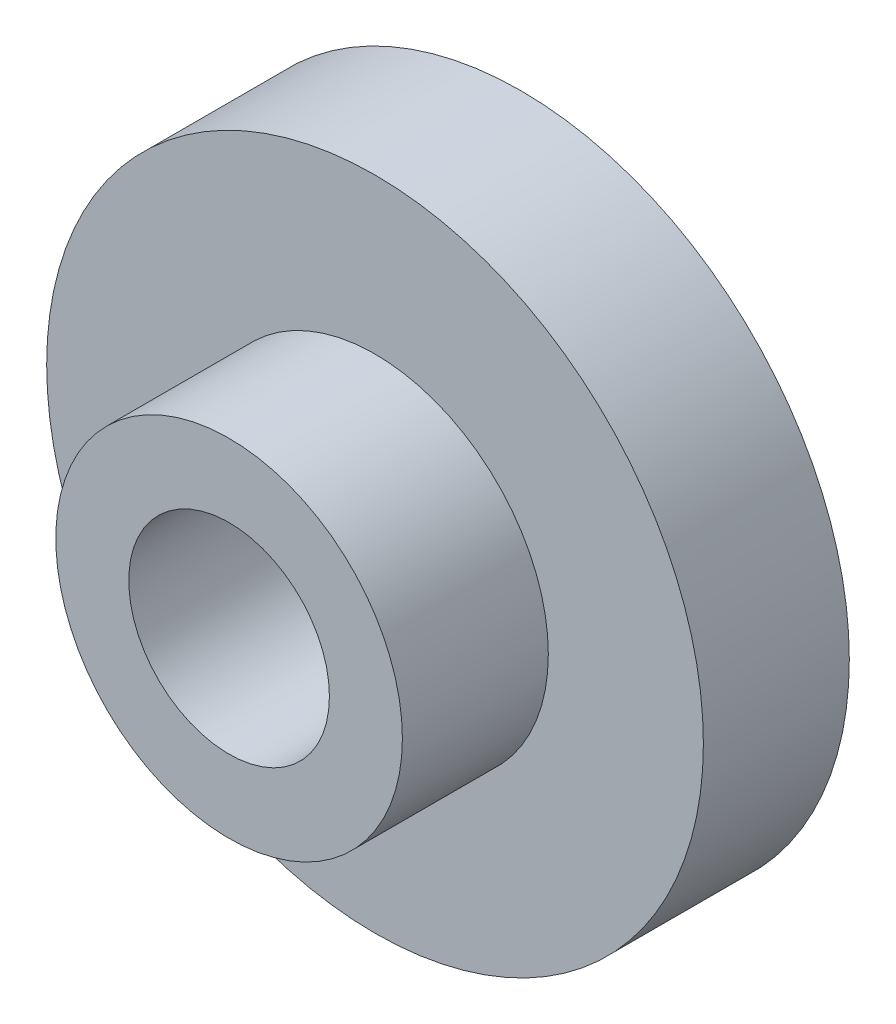
ISO-10303-21;
HEADER;
FILE_DESCRIPTION(('STEP AP214'),'2;1');
FILE_NAME('part.step','',(''),(''),'','','');
FILE_SCHEMA(('AUTOMOTIVE_DESIGN { 1 0 10303 214 1 1 1 1 }'));
ENDSEC;
DATA;
#1=APPLICATION_CONTEXT('core data for automotive mechanical design processes');
#2=APPLICATION_PROTOCOL_DEFINITION('international standard','automotive_design',2000,#1);
#3=PRODUCT_CONTEXT('',#1,'mechanical');
#4=PRODUCT('Part','Part','',(#3));
#5=PRODUCT_RELATED_PRODUCT_CATEGORY('part','',(#4));
#6=PRODUCT_DEFINITION_FORMATION('','',#4);
#7=PRODUCT_DEFINITION_CONTEXT('part definition',#1,'design');
#8=PRODUCT_DEFINITION('design','',#6,#7);
#9=PRODUCT_DEFINITION_SHAPE('','',#8);
#10=(LENGTH_UNIT() NAMED_UNIT(*) SI_UNIT(.MILLI.,.METRE.));
#11=(NAMED_UNIT(*) PLANE_ANGLE_UNIT() SI_UNIT($,.RADIAN.));
#12=(NAMED_UNIT(*) SI_UNIT($,.STERADIAN.) SOLID_ANGLE_UNIT());
#13=UNCERTAINTY_MEASURE_WITH_UNIT(LENGTH_MEASURE(1.E-05),#10,'distance_accuracy_value','');
#14=(GEOMETRIC_REPRESENTATION_CONTEXT(3) GLOBAL_UNCERTAINTY_ASSIGNED_CONTEXT((#13)) GLOBAL_UNIT_ASSIGNED_CONTEXT((#10,
#11,#12)) REPRESENTATION_CONTEXT('',''));
#15=CARTESIAN_POINT('',(0.,0.,0.));
#16=DIRECTION('',(0.,0.,1.));
#17=DIRECTION('',(1.,0.,0.));
#18=AXIS2_PLACEMENT_3D('',#15,#16,#17);
#19=CARTESIAN_POINT('',(0.,0.,4.));
#20=DIRECTION('',(0.,0.,-1.));
#21=DIRECTION('',(-1.,0.,0.));
#22=AXIS2_PLACEMENT_3D('',#19,#20,#21);
#23=CYLINDRICAL_SURFACE('',#22,1.375);
#24=CARTESIAN_POINT('',(0.,0.,4.));
#25=DIRECTION('',(0.,0.,1.));
#26=DIRECTION('',(1.,0.,0.));
#27=AXIS2_PLACEMENT_3D('',#24,#25,#26);
#28=CIRCLE('',#27,1.375);
#29=CARTESIAN_POINT('',(1.375,0.,4.));
#30=VERTEX_POINT('',#29);
#31=EDGE_CURVE('E45',#30,#30,#28,.T.);
#32=ORIENTED_EDGE('',*,*,#31,.T.);
#33=EDGE_LOOP('',(#32));
#34=FACE_BOUND('',#33,.T.);
#35=CARTESIAN_POINT('',(0.,0.,0.));
#36=DIRECTION('',(0.,0.,1.));
#37=DIRECTION('',(1.,0.,0.));
#38=AXIS2_PLACEMENT_3D('',#35,#36,#37);
#39=CIRCLE('',#38,1.375);
#40=CARTESIAN_POINT('',(1.375,0.,0.));
#41=VERTEX_POINT('',#40);
#42=EDGE_CURVE('E40',#41,#41,#39,.T.);
#43=ORIENTED_EDGE('',*,*,#42,.F.);
#44=EDGE_LOOP('',(#43));
#45=FACE_BOUND('',#44,.T.);
#46=ADVANCED_FACE('F37',(#34,#45),#23,.F.);
#47=CARTESIAN_POINT('',(0.,0.,4.));
#48=DIRECTION('',(0.,0.,-1.));
#49=DIRECTION('',(-1.,0.,0.));
#50=AXIS2_PLACEMENT_3D('',#47,#48,#49);
#51=CYLINDRICAL_SURFACE('',#50,2.375);
#52=CARTESIAN_POINT('',(0.,0.,2.));
#53=DIRECTION('',(0.,0.,1.));
#54=DIRECTION('',(1.,0.,0.));
#55=AXIS2_PLACEMENT_3D('',#52,#53,#54);
#56=CIRCLE('',#55,2.375);
#57=CARTESIAN_POINT('',(2.375,0.,2.));
#58=VERTEX_POINT('',#57);
#59=EDGE_CURVE('E56',#58,#58,#56,.T.);
#60=ORIENTED_EDGE('',*,*,#59,.T.);
#61=EDGE_LOOP('',(#60));
#62=FACE_BOUND('',#61,.T.);
#63=CARTESIAN_POINT('',(0.,0.,4.));
#64=DIRECTION('',(0.,0.,1.));
#65=DIRECTION('',(1.,0.,0.));
#66=AXIS2_PLACEMENT_3D('',#63,#64,#65);
#67=CIRCLE('',#66,2.375);
#68=CARTESIAN_POINT('',(2.375,0.,4.));
#69=VERTEX_POINT('',#68);
#70=EDGE_CURVE('E10',#69,#69,#67,.T.);
#71=ORIENTED_EDGE('',*,*,#70,.F.);
#72=EDGE_LOOP('',(#71));
#73=FACE_BOUND('',#72,.T.);
#74=ADVANCED_FACE('F65',(#62,#73),#51,.T.);
#75=CARTESIAN_POINT('',(0.,0.,4.));
#76=DIRECTION('',(0.,0.,1.));
#77=DIRECTION('',(1.,0.,0.));
#78=AXIS2_PLACEMENT_3D('',#75,#76,#77);
#79=PLANE('',#78);
#80=ORIENTED_EDGE('',*,*,#31,.F.);
#81=EDGE_LOOP('',(#80));
#82=FACE_BOUND('',#81,.T.);
#83=ORIENTED_EDGE('',*,*,#70,.T.);
#84=EDGE_LOOP('',(#83));
#85=FACE_BOUND('',#84,.T.);
#86=ADVANCED_FACE('F82',(#82,#85),#79,.T.);
#87=CARTESIAN_POINT('',(0.,0.,0.));
#88=DIRECTION('',(0.,0.,1.));
#89=DIRECTION('',(1.,0.,0.));
#90=AXIS2_PLACEMENT_3D('',#87,#88,#89);
#91=PLANE('',#90);
#92=ORIENTED_EDGE('',*,*,#42,.T.);
#93=EDGE_LOOP('',(#92));
#94=FACE_BOUND('',#93,.T.);
#95=CARTESIAN_POINT('',(0.,0.,0.));
#96=DIRECTION('',(0.,0.,1.));
#97=DIRECTION('',(1.,0.,0.));
#98=AXIS2_PLACEMENT_3D('',#95,#96,#97);
#99=CIRCLE('',#98,4.5);
#100=CARTESIAN_POINT('',(4.5,0.,0.));
#101=VERTEX_POINT('',#100);
#102=EDGE_CURVE('E52',#101,#101,#99,.T.);
#103=ORIENTED_EDGE('',*,*,#102,.F.);
#104=EDGE_LOOP('',(#103));
#105=FACE_BOUND('',#104,.T.);
#106=ADVANCED_FACE('F77',(#94,#105),#91,.F.);
#107=CARTESIAN_POINT('',(0.,0.,2.));
#108=DIRECTION('',(0.,0.,-1.));
#109=DIRECTION('',(-1.,0.,0.));
#110=AXIS2_PLACEMENT_3D('',#107,#108,#109);
#111=CYLINDRICAL_SURFACE('',#110,4.5);
#112=CARTESIAN_POINT('',(0.,0.,2.));
#113=DIRECTION('',(0.,0.,1.));
#114=DIRECTION('',(1.,0.,0.));
#115=AXIS2_PLACEMENT_3D('',#112,#113,#114);
#116=CIRCLE('',#115,4.5);
#117=CARTESIAN_POINT('',(4.5,0.,2.));
#118=VERTEX_POINT('',#117);
#119=EDGE_CURVE('E57',#118,#118,#116,.T.);
#120=ORIENTED_EDGE('',*,*,#119,.F.);
#121=EDGE_LOOP('',(#120));
#122=FACE_BOUND('',#121,.T.);
#123=ORIENTED_EDGE('',*,*,#102,.T.);
#124=EDGE_LOOP('',(#123));
#125=FACE_BOUND('',#124,.T.);
#126=ADVANCED_FACE('F71',(#122,#125),#111,.T.);
#127=CARTESIAN_POINT('',(0.,0.,2.));
#128=DIRECTION('',(0.,0.,1.));
#129=DIRECTION('',(1.,0.,0.));
#130=AXIS2_PLACEMENT_3D('',#127,#128,#129);
#131=PLANE('',#130);
#132=ORIENTED_EDGE('',*,*,#59,.F.);
#133=EDGE_LOOP('',(#132));
#134=FACE_BOUND('',#133,.T.);
#135=ORIENTED_EDGE('',*,*,#119,.T.);
#136=EDGE_LOOP('',(#135));
#137=FACE_BOUND('',#136,.T.);
#138=ADVANCED_FACE('F68',(#134,#137),#131,.T.);
#139=CLOSED_SHELL('',(#46,#74,#86,#106,#126,#138));
#140=MANIFOLD_SOLID_BREP('B2',#139);
#141=ADVANCED_BREP_SHAPE_REPRESENTATION('',(#18,#140),#14);
#142=SHAPE_DEFINITION_REPRESENTATION(#9,#141);
ENDSEC;
END-ISO-10303-21;
